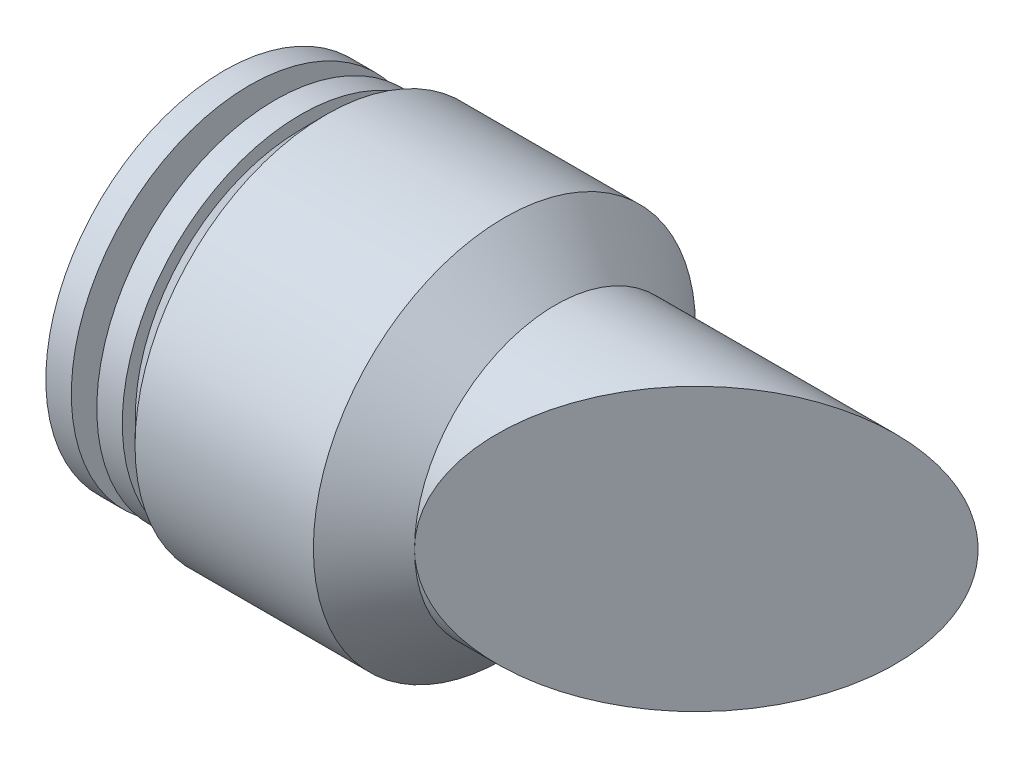
ISO-10303-21;
HEADER;
FILE_DESCRIPTION(('STEP AP214'),'2;1');
FILE_NAME('part.step','',(''),(''),'','','');
FILE_SCHEMA(('AUTOMOTIVE_DESIGN { 1 0 10303 214 1 1 1 1 }'));
ENDSEC;
DATA;
#1=APPLICATION_CONTEXT('core data for automotive mechanical design processes');
#2=APPLICATION_PROTOCOL_DEFINITION('international standard','automotive_design',2000,#1);
#3=PRODUCT_CONTEXT('',#1,'mechanical');
#4=PRODUCT('Part','Part','',(#3));
#5=PRODUCT_RELATED_PRODUCT_CATEGORY('part','',(#4));
#6=PRODUCT_DEFINITION_FORMATION('','',#4);
#7=PRODUCT_DEFINITION_CONTEXT('part definition',#1,'design');
#8=PRODUCT_DEFINITION('design','',#6,#7);
#9=PRODUCT_DEFINITION_SHAPE('','',#8);
#10=(LENGTH_UNIT() NAMED_UNIT(*) SI_UNIT(.MILLI.,.METRE.));
#11=(NAMED_UNIT(*) PLANE_ANGLE_UNIT() SI_UNIT($,.RADIAN.));
#12=(NAMED_UNIT(*) SI_UNIT($,.STERADIAN.) SOLID_ANGLE_UNIT());
#13=UNCERTAINTY_MEASURE_WITH_UNIT(LENGTH_MEASURE(1.E-05),#10,'distance_accuracy_value','');
#14=(GEOMETRIC_REPRESENTATION_CONTEXT(3) GLOBAL_UNCERTAINTY_ASSIGNED_CONTEXT((#13)) GLOBAL_UNIT_ASSIGNED_CONTEXT((#10,
#11,#12)) REPRESENTATION_CONTEXT('',''));
#15=CARTESIAN_POINT('',(0.,0.,0.));
#16=DIRECTION('',(0.,0.,1.));
#17=DIRECTION('',(1.,0.,0.));
#18=AXIS2_PLACEMENT_3D('',#15,#16,#17);
#19=CARTESIAN_POINT('',(-9.43208916510545,2.07725321888412,0.));
#20=DIRECTION('',(-1.,0.,0.));
#21=DIRECTION('',(0.,-1.,0.));
#22=AXIS2_PLACEMENT_3D('',#19,#20,#21);
#23=PLANE('',#22);
#24=CARTESIAN_POINT('',(-9.43208916510545,2.07725321888412,0.));
#25=DIRECTION('',(-1.,0.,0.));
#26=DIRECTION('',(0.,-1.,0.));
#27=AXIS2_PLACEMENT_3D('',#24,#25,#26);
#28=CIRCLE('',#27,3.);
#29=CARTESIAN_POINT('',(-9.43208916510545,-0.922746781115885,0.));
#30=VERTEX_POINT('',#29);
#31=EDGE_CURVE('E50',#30,#30,#28,.T.);
#32=ORIENTED_EDGE('',*,*,#31,.F.);
#33=EDGE_LOOP('',(#32));
#34=FACE_BOUND('',#33,.T.);
#35=CARTESIAN_POINT('',(-9.43208916510545,2.07725321888412,0.));
#36=DIRECTION('',(1.,0.,0.));
#37=DIRECTION('',(0.,1.,0.));
#38=AXIS2_PLACEMENT_3D('',#35,#36,#37);
#39=CIRCLE('',#38,7.);
#40=CARTESIAN_POINT('',(-9.43208916510545,9.07725321888412,0.));
#41=VERTEX_POINT('',#40);
#42=EDGE_CURVE('E11',#41,#41,#39,.T.);
#43=ORIENTED_EDGE('',*,*,#42,.F.);
#44=EDGE_LOOP('',(#43));
#45=FACE_BOUND('',#44,.T.);
#46=ADVANCED_FACE('F36',(#34,#45),#23,.T.);
#47=CARTESIAN_POINT('',(15.5679108348946,2.07725321888412,0.));
#48=DIRECTION('',(1.,0.,0.));
#49=DIRECTION('',(0.,1.,0.));
#50=AXIS2_PLACEMENT_3D('',#47,#48,#49);
#51=CYLINDRICAL_SURFACE('',#50,7.);
#52=ORIENTED_EDGE('',*,*,#42,.T.);
#53=EDGE_LOOP('',(#52));
#54=FACE_BOUND('',#53,.T.);
#55=CARTESIAN_POINT('',(-8.43208916510545,2.07725321888412,0.));
#56=DIRECTION('',(1.,0.,0.));
#57=DIRECTION('',(0.,1.,0.));
#58=AXIS2_PLACEMENT_3D('',#55,#56,#57);
#59=CIRCLE('',#58,7.00000000000001);
#60=CARTESIAN_POINT('',(-8.43208916510545,9.07725321888412,0.));
#61=VERTEX_POINT('',#60);
#62=EDGE_CURVE('E43',#61,#61,#59,.T.);
#63=ORIENTED_EDGE('',*,*,#62,.F.);
#64=EDGE_LOOP('',(#63));
#65=FACE_BOUND('',#64,.T.);
#66=ADVANCED_FACE('F88',(#54,#65),#51,.T.);
#67=CARTESIAN_POINT('',(-8.43208916510545,9.07725321888412,0.));
#68=DIRECTION('',(1.,0.,0.));
#69=DIRECTION('',(0.,1.,0.));
#70=AXIS2_PLACEMENT_3D('',#67,#68,#69);
#71=PLANE('',#70);
#72=ORIENTED_EDGE('',*,*,#62,.T.);
#73=EDGE_LOOP('',(#72));
#74=FACE_BOUND('',#73,.T.);
#75=CARTESIAN_POINT('',(-8.43208916510545,2.07725321888412,0.));
#76=DIRECTION('',(1.,0.,0.));
#77=DIRECTION('',(0.,1.,0.));
#78=AXIS2_PLACEMENT_3D('',#75,#76,#77);
#79=CIRCLE('',#78,4.);
#80=CARTESIAN_POINT('',(-8.43208916510545,6.07725321888412,0.));
#81=VERTEX_POINT('',#80);
#82=EDGE_CURVE('E79',#81,#81,#79,.T.);
#83=ORIENTED_EDGE('',*,*,#82,.F.);
#84=EDGE_LOOP('',(#83));
#85=FACE_BOUND('',#84,.T.);
#86=ADVANCED_FACE('F85',(#74,#85),#71,.T.);
#87=CARTESIAN_POINT('',(15.5679108348946,2.07725321888412,0.));
#88=DIRECTION('',(1.,0.,0.));
#89=DIRECTION('',(0.,1.,0.));
#90=AXIS2_PLACEMENT_3D('',#87,#88,#89);
#91=CYLINDRICAL_SURFACE('',#90,4.);
#92=ORIENTED_EDGE('',*,*,#82,.T.);
#93=EDGE_LOOP('',(#92));
#94=FACE_BOUND('',#93,.T.);
#95=CARTESIAN_POINT('',(-7.43208916510545,2.07725321888412,0.));
#96=DIRECTION('',(1.,0.,0.));
#97=DIRECTION('',(0.,1.,0.));
#98=AXIS2_PLACEMENT_3D('',#95,#96,#97);
#99=CIRCLE('',#98,4.);
#100=CARTESIAN_POINT('',(-7.43208916510545,6.07725321888411,0.));
#101=VERTEX_POINT('',#100);
#102=EDGE_CURVE('E76',#101,#101,#99,.T.);
#103=ORIENTED_EDGE('',*,*,#102,.F.);
#104=EDGE_LOOP('',(#103));
#105=FACE_BOUND('',#104,.T.);
#106=ADVANCED_FACE('F95',(#94,#105),#91,.T.);
#107=CARTESIAN_POINT('',(-7.43208916510545,6.07725321888411,0.));
#108=DIRECTION('',(-1.,0.,0.));
#109=DIRECTION('',(0.,-1.,0.));
#110=AXIS2_PLACEMENT_3D('',#107,#108,#109);
#111=PLANE('',#110);
#112=ORIENTED_EDGE('',*,*,#102,.T.);
#113=EDGE_LOOP('',(#112));
#114=FACE_BOUND('',#113,.T.);
#115=CARTESIAN_POINT('',(-7.43208916510545,2.07725321888412,0.));
#116=DIRECTION('',(1.,0.,0.));
#117=DIRECTION('',(0.,1.,0.));
#118=AXIS2_PLACEMENT_3D('',#115,#116,#117);
#119=CIRCLE('',#118,7.);
#120=CARTESIAN_POINT('',(-7.43208916510545,9.07725321888412,0.));
#121=VERTEX_POINT('',#120);
#122=EDGE_CURVE('E73',#121,#121,#119,.T.);
#123=ORIENTED_EDGE('',*,*,#122,.F.);
#124=EDGE_LOOP('',(#123));
#125=FACE_BOUND('',#124,.T.);
#126=ADVANCED_FACE('F101',(#114,#125),#111,.T.);
#127=CARTESIAN_POINT('',(15.5679108348946,2.07725321888412,0.));
#128=DIRECTION('',(1.,0.,0.));
#129=DIRECTION('',(0.,1.,0.));
#130=AXIS2_PLACEMENT_3D('',#127,#128,#129);
#131=CYLINDRICAL_SURFACE('',#130,7.);
#132=ORIENTED_EDGE('',*,*,#122,.T.);
#133=EDGE_LOOP('',(#132));
#134=FACE_BOUND('',#133,.T.);
#135=CARTESIAN_POINT('',(-6.43208916510545,2.07725321888412,0.));
#136=DIRECTION('',(1.,0.,0.));
#137=DIRECTION('',(0.,1.,0.));
#138=AXIS2_PLACEMENT_3D('',#135,#136,#137);
#139=CIRCLE('',#138,7.);
#140=CARTESIAN_POINT('',(-6.43208916510545,9.07725321888412,0.));
#141=VERTEX_POINT('',#140);
#142=EDGE_CURVE('E70',#141,#141,#139,.T.);
#143=ORIENTED_EDGE('',*,*,#142,.F.);
#144=EDGE_LOOP('',(#143));
#145=FACE_BOUND('',#144,.T.);
#146=ADVANCED_FACE('F105',(#134,#145),#131,.T.);
#147=CARTESIAN_POINT('',(-6.43208916510545,9.07725321888412,0.));
#148=DIRECTION('',(1.,0.,0.));
#149=DIRECTION('',(0.,1.,0.));
#150=AXIS2_PLACEMENT_3D('',#147,#148,#149);
#151=PLANE('',#150);
#152=ORIENTED_EDGE('',*,*,#142,.T.);
#153=EDGE_LOOP('',(#152));
#154=FACE_BOUND('',#153,.T.);
#155=CARTESIAN_POINT('',(-6.43208916510545,2.07725321888412,0.));
#156=DIRECTION('',(1.,0.,0.));
#157=DIRECTION('',(0.,1.,0.));
#158=AXIS2_PLACEMENT_3D('',#155,#156,#157);
#159=CIRCLE('',#158,6.48477157360406);
#160=CARTESIAN_POINT('',(-6.43208916510545,8.56202479248818,0.));
#161=VERTEX_POINT('',#160);
#162=EDGE_CURVE('E67',#161,#161,#159,.T.);
#163=ORIENTED_EDGE('',*,*,#162,.F.);
#164=EDGE_LOOP('',(#163));
#165=FACE_BOUND('',#164,.T.);
#166=ADVANCED_FACE('F109',(#154,#165),#151,.T.);
#167=CARTESIAN_POINT('',(-5.43208916510545,2.07725321888412,0.));
#168=DIRECTION('',(1.,0.,0.));
#169=DIRECTION('',(0.,1.,0.));
#170=AXIS2_PLACEMENT_3D('',#167,#168,#169);
#171=CONICAL_SURFACE('',#170,7.5,0.792954694628225);
#172=ORIENTED_EDGE('',*,*,#162,.T.);
#173=EDGE_LOOP('',(#172));
#174=FACE_BOUND('',#173,.T.);
#175=CARTESIAN_POINT('',(-5.43208916510545,2.07725321888412,0.));
#176=DIRECTION('',(1.,0.,0.));
#177=DIRECTION('',(0.,1.,0.));
#178=AXIS2_PLACEMENT_3D('',#175,#176,#177);
#179=CIRCLE('',#178,7.5);
#180=CARTESIAN_POINT('',(-5.43208916510545,9.57725321888412,0.));
#181=VERTEX_POINT('',#180);
#182=EDGE_CURVE('E64',#181,#181,#179,.T.);
#183=ORIENTED_EDGE('',*,*,#182,.F.);
#184=EDGE_LOOP('',(#183));
#185=FACE_BOUND('',#184,.T.);
#186=ADVANCED_FACE('F113',(#174,#185),#171,.T.);
#187=CARTESIAN_POINT('',(15.5679108348946,2.07725321888412,0.));
#188=DIRECTION('',(1.,0.,0.));
#189=DIRECTION('',(0.,1.,0.));
#190=AXIS2_PLACEMENT_3D('',#187,#188,#189);
#191=CYLINDRICAL_SURFACE('',#190,7.5);
#192=ORIENTED_EDGE('',*,*,#182,.T.);
#193=EDGE_LOOP('',(#192));
#194=FACE_BOUND('',#193,.T.);
#195=CARTESIAN_POINT('',(1.56791083489455,2.07725321888412,0.));
#196=DIRECTION('',(1.,0.,0.));
#197=DIRECTION('',(0.,1.,0.));
#198=AXIS2_PLACEMENT_3D('',#195,#196,#197);
#199=CIRCLE('',#198,7.5);
#200=CARTESIAN_POINT('',(1.56791083489455,9.57725321888412,0.));
#201=VERTEX_POINT('',#200);
#202=EDGE_CURVE('E61',#201,#201,#199,.T.);
#203=ORIENTED_EDGE('',*,*,#202,.F.);
#204=EDGE_LOOP('',(#203));
#205=FACE_BOUND('',#204,.T.);
#206=ADVANCED_FACE('F117',(#194,#205),#191,.T.);
#207=CARTESIAN_POINT('',(3.56791083489455,2.07725321888412,0.));
#208=DIRECTION('',(-1.,0.,0.));
#209=DIRECTION('',(0.,-1.,0.));
#210=AXIS2_PLACEMENT_3D('',#207,#208,#209);
#211=CONICAL_SURFACE('',#210,5.53,0.777841632166672);
#212=ORIENTED_EDGE('',*,*,#202,.T.);
#213=EDGE_LOOP('',(#212));
#214=FACE_BOUND('',#213,.T.);
#215=CARTESIAN_POINT('',(3.56791083489455,2.07725321888412,0.));
#216=DIRECTION('',(1.,0.,0.));
#217=DIRECTION('',(0.,1.,0.));
#218=AXIS2_PLACEMENT_3D('',#215,#216,#217);
#219=CIRCLE('',#218,5.53);
#220=CARTESIAN_POINT('',(3.56791083489455,2.07725321888412,5.53));
#221=VERTEX_POINT('',#220);
#222=EDGE_CURVE('E57',#221,#221,#219,.T.);
#223=ORIENTED_EDGE('',*,*,#222,.F.);
#224=EDGE_LOOP('',(#223));
#225=FACE_BOUND('',#224,.T.);
#226=ADVANCED_FACE('F121',(#214,#225),#211,.T.);
#227=CARTESIAN_POINT('',(15.5679108348946,2.07725321888412,0.));
#228=DIRECTION('',(1.,0.,0.));
#229=DIRECTION('',(0.,1.,0.));
#230=AXIS2_PLACEMENT_3D('',#227,#228,#229);
#231=CYLINDRICAL_SURFACE('',#230,5.53);
#232=ORIENTED_EDGE('',*,*,#222,.T.);
#233=CARTESIAN_POINT('',(9.09791083489453,2.07725321888412,0.));
#234=DIRECTION('',(-0.707106781186549,0.,-0.707106781186546));
#235=DIRECTION('',(0.707106781186546,0.,-0.707106781186549));
#236=AXIS2_PLACEMENT_3D('',#233,#234,#235);
#237=ELLIPSE('',#236,7.8206009999232,5.53);
#238=EDGE_CURVE('E39',#221,#221,#237,.F.);
#239=ORIENTED_EDGE('',*,*,#238,.F.);
#240=EDGE_LOOP('',(#232,#239));
#241=FACE_BOUND('',#240,.T.);
#242=ADVANCED_FACE('F125',(#241),#231,.T.);
#243=CARTESIAN_POINT('',(-3.43208916510545,2.07725321888412,0.));
#244=DIRECTION('',(-1.,0.,0.));
#245=DIRECTION('',(0.,-1.,0.));
#246=AXIS2_PLACEMENT_3D('',#243,#244,#245);
#247=CYLINDRICAL_SURFACE('',#246,3.);
#248=CARTESIAN_POINT('',(-3.43208916510545,2.07725321888412,0.));
#249=DIRECTION('',(-1.,0.,0.));
#250=DIRECTION('',(0.,-1.,0.));
#251=AXIS2_PLACEMENT_3D('',#248,#249,#250);
#252=CIRCLE('',#251,3.);
#253=CARTESIAN_POINT('',(-3.43208916510545,-0.922746781115884,0.));
#254=VERTEX_POINT('',#253);
#255=EDGE_CURVE('E52',#254,#254,#252,.T.);
#256=ORIENTED_EDGE('',*,*,#255,.F.);
#257=EDGE_LOOP('',(#256));
#258=FACE_BOUND('',#257,.T.);
#259=ORIENTED_EDGE('',*,*,#31,.T.);
#260=EDGE_LOOP('',(#259));
#261=FACE_BOUND('',#260,.T.);
#262=ADVANCED_FACE('F129',(#258,#261),#247,.F.);
#263=CARTESIAN_POINT('',(-3.43208916510545,2.07725321888412,0.));
#264=DIRECTION('',(-1.,0.,0.));
#265=DIRECTION('',(0.,-1.,0.));
#266=AXIS2_PLACEMENT_3D('',#263,#264,#265);
#267=PLANE('',#266);
#268=ORIENTED_EDGE('',*,*,#255,.T.);
#269=EDGE_LOOP('',(#268));
#270=FACE_BOUND('',#269,.T.);
#271=ADVANCED_FACE('F132',(#270),#267,.T.);
#272=CARTESIAN_POINT('',(3.56791083489455,-5.42274678111588,5.53));
#273=DIRECTION('',(-0.707106781186549,0.,-0.707106781186546));
#274=DIRECTION('',(-0.707106781186546,0.,0.707106781186549));
#275=AXIS2_PLACEMENT_3D('',#272,#273,#274);
#276=PLANE('',#275);
#277=ORIENTED_EDGE('',*,*,#238,.T.);
#278=EDGE_LOOP('',(#277));
#279=FACE_BOUND('',#278,.T.);
#280=ADVANCED_FACE('F47',(#279),#276,.F.);
#281=CLOSED_SHELL('',(#46,#66,#86,#106,#126,#146,#166,#186,#206,#226,#242,#262,#271,#280));
#282=MANIFOLD_SOLID_BREP('B2',#281);
#283=ADVANCED_BREP_SHAPE_REPRESENTATION('',(#18,#282),#14);
#284=SHAPE_DEFINITION_REPRESENTATION(#9,#283);
ENDSEC;
END-ISO-10303-21;
